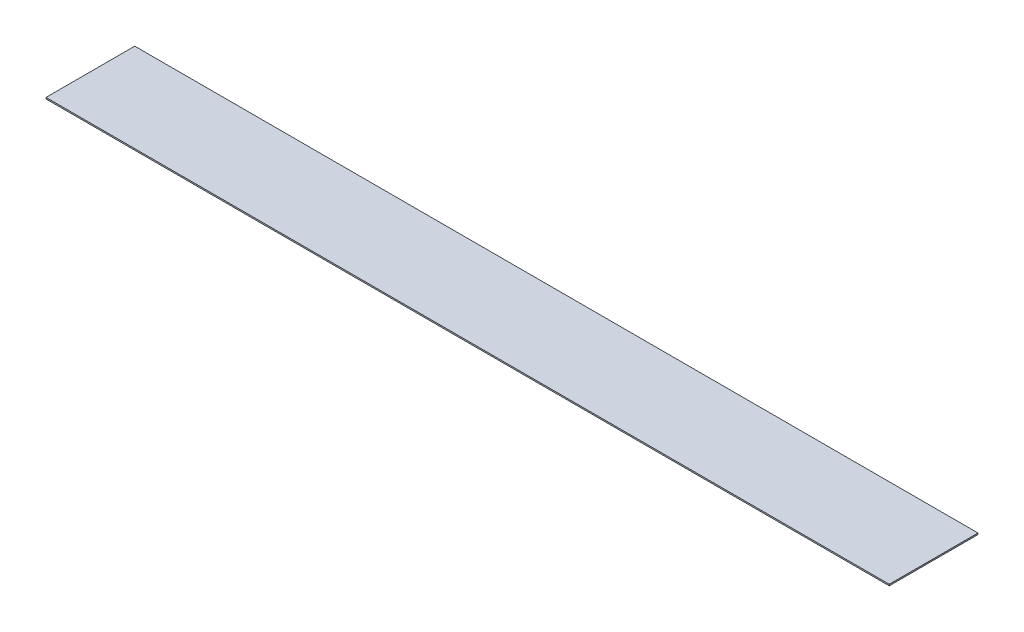
ISO-10303-21;
HEADER;
FILE_DESCRIPTION(('STEP AP214'),'2;1');
FILE_NAME('part.step','',(''),(''),'','','');
FILE_SCHEMA(('AUTOMOTIVE_DESIGN { 1 0 10303 214 1 1 1 1 }'));
ENDSEC;
DATA;
#1=APPLICATION_CONTEXT('core data for automotive mechanical design processes');
#2=APPLICATION_PROTOCOL_DEFINITION('international standard','automotive_design',2000,#1);
#3=PRODUCT_CONTEXT('',#1,'mechanical');
#4=PRODUCT('Part','Part','',(#3));
#5=PRODUCT_RELATED_PRODUCT_CATEGORY('part','',(#4));
#6=PRODUCT_DEFINITION_FORMATION('','',#4);
#7=PRODUCT_DEFINITION_CONTEXT('part definition',#1,'design');
#8=PRODUCT_DEFINITION('design','',#6,#7);
#9=PRODUCT_DEFINITION_SHAPE('','',#8);
#10=(LENGTH_UNIT() NAMED_UNIT(*) SI_UNIT(.MILLI.,.METRE.));
#11=(NAMED_UNIT(*) PLANE_ANGLE_UNIT() SI_UNIT($,.RADIAN.));
#12=(NAMED_UNIT(*) SI_UNIT($,.STERADIAN.) SOLID_ANGLE_UNIT());
#13=UNCERTAINTY_MEASURE_WITH_UNIT(LENGTH_MEASURE(1.E-05),#10,'distance_accuracy_value','');
#14=(GEOMETRIC_REPRESENTATION_CONTEXT(3) GLOBAL_UNCERTAINTY_ASSIGNED_CONTEXT((#13)) GLOBAL_UNIT_ASSIGNED_CONTEXT((#10,
#11,#12)) REPRESENTATION_CONTEXT('',''));
#15=CARTESIAN_POINT('',(0.,0.,0.));
#16=DIRECTION('',(0.,0.,1.));
#17=DIRECTION('',(1.,0.,0.));
#18=AXIS2_PLACEMENT_3D('',#15,#16,#17);
#19=CARTESIAN_POINT('',(0.,1.5875,0.));
#20=DIRECTION('',(1.,0.,0.));
#21=DIRECTION('',(0.,0.,-1.));
#22=AXIS2_PLACEMENT_3D('',#19,#20,#21);
#23=PLANE('',#22);
#24=DIRECTION('',(0.,0.,1.));
#25=VECTOR('',#24,1.);
#26=CARTESIAN_POINT('',(0.,0.,0.));
#27=LINE('',#26,#25);
#28=CARTESIAN_POINT('',(0.,0.,-101.6));
#29=VERTEX_POINT('',#28);
#30=CARTESIAN_POINT('',(0.,0.,0.));
#31=VERTEX_POINT('',#30);
#32=EDGE_CURVE('E96',#29,#31,#27,.T.);
#33=ORIENTED_EDGE('',*,*,#32,.T.);
#34=DIRECTION('',(0.,-1.,0.));
#35=VECTOR('',#34,1.);
#36=CARTESIAN_POINT('',(0.,1.5875,0.));
#37=LINE('',#36,#35);
#38=CARTESIAN_POINT('',(0.,1.5875,0.));
#39=VERTEX_POINT('',#38);
#40=EDGE_CURVE('E11',#39,#31,#37,.T.);
#41=ORIENTED_EDGE('',*,*,#40,.F.);
#42=DIRECTION('',(0.,0.,1.));
#43=VECTOR('',#42,1.);
#44=CARTESIAN_POINT('',(0.,1.5875,0.));
#45=LINE('',#44,#43);
#46=CARTESIAN_POINT('',(0.,1.5875,-101.6));
#47=VERTEX_POINT('',#46);
#48=EDGE_CURVE('E84',#47,#39,#45,.T.);
#49=ORIENTED_EDGE('',*,*,#48,.F.);
#50=DIRECTION('',(0.,-1.,0.));
#51=VECTOR('',#50,1.);
#52=CARTESIAN_POINT('',(0.,1.5875,-101.6));
#53=LINE('',#52,#51);
#54=EDGE_CURVE('E92',#47,#29,#53,.T.);
#55=ORIENTED_EDGE('',*,*,#54,.T.);
#56=EDGE_LOOP('',(#33,#41,#49,#55));
#57=FACE_BOUND('',#56,.T.);
#58=ADVANCED_FACE('F33',(#57),#23,.F.);
#59=CARTESIAN_POINT('',(0.,1.5875,0.));
#60=DIRECTION('',(0.,0.,-1.));
#61=DIRECTION('',(-1.,0.,0.));
#62=AXIS2_PLACEMENT_3D('',#59,#60,#61);
#63=PLANE('',#62);
#64=DIRECTION('',(1.,0.,0.));
#65=VECTOR('',#64,1.);
#66=CARTESIAN_POINT('',(0.,0.,0.));
#67=LINE('',#66,#65);
#68=CARTESIAN_POINT('',(965.2,0.,0.));
#69=VERTEX_POINT('',#68);
#70=EDGE_CURVE('E88',#31,#69,#67,.T.);
#71=ORIENTED_EDGE('',*,*,#70,.T.);
#72=DIRECTION('',(0.,-1.,0.));
#73=VECTOR('',#72,1.);
#74=CARTESIAN_POINT('',(965.2,1.5875,0.));
#75=LINE('',#74,#73);
#76=CARTESIAN_POINT('',(965.2,1.5875,0.));
#77=VERTEX_POINT('',#76);
#78=EDGE_CURVE('E41',#77,#69,#75,.T.);
#79=ORIENTED_EDGE('',*,*,#78,.F.);
#80=DIRECTION('',(1.,0.,0.));
#81=VECTOR('',#80,1.);
#82=CARTESIAN_POINT('',(0.,1.5875,0.));
#83=LINE('',#82,#81);
#84=EDGE_CURVE('E79',#39,#77,#83,.T.);
#85=ORIENTED_EDGE('',*,*,#84,.F.);
#86=ORIENTED_EDGE('',*,*,#40,.T.);
#87=EDGE_LOOP('',(#71,#79,#85,#86));
#88=FACE_BOUND('',#87,.T.);
#89=ADVANCED_FACE('F87',(#88),#63,.F.);
#90=CARTESIAN_POINT('',(965.2,1.5875,0.));
#91=DIRECTION('',(-1.,0.,0.));
#92=DIRECTION('',(0.,0.,1.));
#93=AXIS2_PLACEMENT_3D('',#90,#91,#92);
#94=PLANE('',#93);
#95=DIRECTION('',(0.,0.,-1.));
#96=VECTOR('',#95,1.);
#97=CARTESIAN_POINT('',(965.2,0.,0.));
#98=LINE('',#97,#96);
#99=CARTESIAN_POINT('',(965.2,0.,-101.6));
#100=VERTEX_POINT('',#99);
#101=EDGE_CURVE('E66',#69,#100,#98,.T.);
#102=ORIENTED_EDGE('',*,*,#101,.T.);
#103=DIRECTION('',(0.,-1.,0.));
#104=VECTOR('',#103,1.);
#105=CARTESIAN_POINT('',(965.2,1.5875,-101.6));
#106=LINE('',#105,#104);
#107=CARTESIAN_POINT('',(965.2,1.5875,-101.6));
#108=VERTEX_POINT('',#107);
#109=EDGE_CURVE('E89',#108,#100,#106,.T.);
#110=ORIENTED_EDGE('',*,*,#109,.F.);
#111=DIRECTION('',(0.,0.,-1.));
#112=VECTOR('',#111,1.);
#113=CARTESIAN_POINT('',(965.2,1.5875,0.));
#114=LINE('',#113,#112);
#115=EDGE_CURVE('E82',#77,#108,#114,.T.);
#116=ORIENTED_EDGE('',*,*,#115,.F.);
#117=ORIENTED_EDGE('',*,*,#78,.T.);
#118=EDGE_LOOP('',(#102,#110,#116,#117));
#119=FACE_BOUND('',#118,.T.);
#120=ADVANCED_FACE('F90',(#119),#94,.F.);
#121=CARTESIAN_POINT('',(0.,1.5875,-101.6));
#122=DIRECTION('',(0.,0.,1.));
#123=DIRECTION('',(1.,0.,0.));
#124=AXIS2_PLACEMENT_3D('',#121,#122,#123);
#125=PLANE('',#124);
#126=DIRECTION('',(-1.,0.,0.));
#127=VECTOR('',#126,1.);
#128=CARTESIAN_POINT('',(0.,0.,-101.6));
#129=LINE('',#128,#127);
#130=EDGE_CURVE('E72',#100,#29,#129,.T.);
#131=ORIENTED_EDGE('',*,*,#130,.T.);
#132=ORIENTED_EDGE('',*,*,#54,.F.);
#133=DIRECTION('',(-1.,0.,0.));
#134=VECTOR('',#133,1.);
#135=CARTESIAN_POINT('',(0.,1.5875,-101.6));
#136=LINE('',#135,#134);
#137=EDGE_CURVE('E49',#108,#47,#136,.T.);
#138=ORIENTED_EDGE('',*,*,#137,.F.);
#139=ORIENTED_EDGE('',*,*,#109,.T.);
#140=EDGE_LOOP('',(#131,#132,#138,#139));
#141=FACE_BOUND('',#140,.T.);
#142=ADVANCED_FACE('F103',(#141),#125,.F.);
#143=CARTESIAN_POINT('',(0.,1.5875,0.));
#144=DIRECTION('',(0.,-1.,0.));
#145=DIRECTION('',(0.,0.,-1.));
#146=AXIS2_PLACEMENT_3D('',#143,#144,#145);
#147=PLANE('',#146);
#148=ORIENTED_EDGE('',*,*,#48,.T.);
#149=ORIENTED_EDGE('',*,*,#84,.T.);
#150=ORIENTED_EDGE('',*,*,#115,.T.);
#151=ORIENTED_EDGE('',*,*,#137,.T.);
#152=EDGE_LOOP('',(#148,#149,#150,#151));
#153=FACE_BOUND('',#152,.T.);
#154=ADVANCED_FACE('F80',(#153),#147,.F.);
#155=CARTESIAN_POINT('',(0.,0.,0.));
#156=DIRECTION('',(0.,-1.,0.));
#157=DIRECTION('',(0.,0.,-1.));
#158=AXIS2_PLACEMENT_3D('',#155,#156,#157);
#159=PLANE('',#158);
#160=ORIENTED_EDGE('',*,*,#32,.F.);
#161=ORIENTED_EDGE('',*,*,#130,.F.);
#162=ORIENTED_EDGE('',*,*,#101,.F.);
#163=ORIENTED_EDGE('',*,*,#70,.F.);
#164=EDGE_LOOP('',(#160,#161,#162,#163));
#165=FACE_BOUND('',#164,.T.);
#166=ADVANCED_FACE('F106',(#165),#159,.T.);
#167=CLOSED_SHELL('',(#58,#89,#120,#142,#154,#166));
#168=MANIFOLD_SOLID_BREP('B2',#167);
#169=ADVANCED_BREP_SHAPE_REPRESENTATION('',(#18,#168),#14);
#170=SHAPE_DEFINITION_REPRESENTATION(#9,#169);
ENDSEC;
END-ISO-10303-21;
